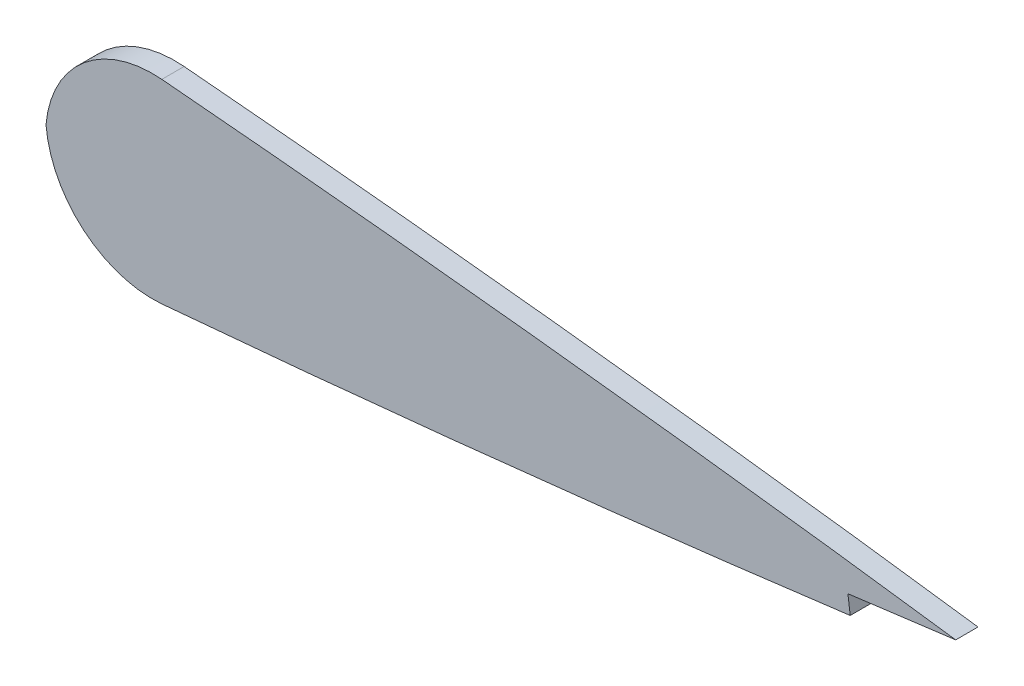
ISO-10303-21;
HEADER;
FILE_DESCRIPTION(('STEP AP214'),'2;1');
FILE_NAME('part.step','',(''),(''),'','','');
FILE_SCHEMA(('AUTOMOTIVE_DESIGN { 1 0 10303 214 1 1 1 1 }'));
ENDSEC;
DATA;
#1=APPLICATION_CONTEXT('core data for automotive mechanical design processes');
#2=APPLICATION_PROTOCOL_DEFINITION('international standard','automotive_design',2000,#1);
#3=PRODUCT_CONTEXT('',#1,'mechanical');
#4=PRODUCT('Part','Part','',(#3));
#5=PRODUCT_RELATED_PRODUCT_CATEGORY('part','',(#4));
#6=PRODUCT_DEFINITION_FORMATION('','',#4);
#7=PRODUCT_DEFINITION_CONTEXT('part definition',#1,'design');
#8=PRODUCT_DEFINITION('design','',#6,#7);
#9=PRODUCT_DEFINITION_SHAPE('','',#8);
#10=(LENGTH_UNIT() NAMED_UNIT(*) SI_UNIT(.MILLI.,.METRE.));
#11=(NAMED_UNIT(*) PLANE_ANGLE_UNIT() SI_UNIT($,.RADIAN.));
#12=(NAMED_UNIT(*) SI_UNIT($,.STERADIAN.) SOLID_ANGLE_UNIT());
#13=UNCERTAINTY_MEASURE_WITH_UNIT(LENGTH_MEASURE(1.E-05),#10,'distance_accuracy_value','');
#14=(GEOMETRIC_REPRESENTATION_CONTEXT(3) GLOBAL_UNCERTAINTY_ASSIGNED_CONTEXT((#13)) GLOBAL_UNIT_ASSIGNED_CONTEXT((#10,
#11,#12)) REPRESENTATION_CONTEXT('',''));
#15=CARTESIAN_POINT('',(0.,0.,0.));
#16=DIRECTION('',(0.,0.,1.));
#17=DIRECTION('',(1.,0.,0.));
#18=AXIS2_PLACEMENT_3D('',#15,#16,#17);
#19=CARTESIAN_POINT('',(318.77,0.4016502,3.175));
#20=CARTESIAN_POINT('',(318.651672050798,0.50081062510207,3.175));
#21=CARTESIAN_POINT('',(317.88713952083,0.407183951533016,3.175));
#22=CARTESIAN_POINT('',(316.525702267064,0.7904298347905,3.175));
#23=CARTESIAN_POINT('',(314.029007456015,1.02731081399014,3.175));
#24=CARTESIAN_POINT('',(310.665580367581,1.53568645613262,3.175));
#25=CARTESIAN_POINT('',(306.332982445315,2.1029997142592,3.175));
#26=CARTESIAN_POINT('',(301.108142880642,2.80218722429085,3.175));
#27=CARTESIAN_POINT('',(295.004655139781,3.59255228155884,3.175));
#28=CARTESIAN_POINT('',(288.066717305627,4.47252129999186,3.175));
#29=CARTESIAN_POINT('',(280.334877507848,5.42667867616247,3.175));
#30=CARTESIAN_POINT('',(271.857503413929,6.44211126091389,3.175));
#31=CARTESIAN_POINT('',(262.68670258513,7.50622472654808,3.175));
#32=CARTESIAN_POINT('',(252.878949160097,8.60453143464443,3.175));
#33=CARTESIAN_POINT('',(242.494745531819,9.72362194936592,3.175));
#34=CARTESIAN_POINT('',(231.598187206488,10.8495970231666,3.175));
#35=CARTESIAN_POINT('',(220.256428580463,11.9679230852741,3.175));
#36=CARTESIAN_POINT('',(208.539426289446,13.0629021970691,3.175));
#37=CARTESIAN_POINT('',(196.519338709918,14.1201595424354,3.175));
#38=CARTESIAN_POINT('',(184.270405083069,15.1220196708537,3.175));
#39=CARTESIAN_POINT('',(171.867889748649,16.0521472129467,3.175));
#40=CARTESIAN_POINT('',(159.388371015463,16.8932736087619,3.175));
#41=CARTESIAN_POINT('',(146.908740176365,17.6278116310836,3.175));
#42=CARTESIAN_POINT('',(134.505824676557,18.23720410278,3.175));
#43=CARTESIAN_POINT('',(122.256224526093,18.705201006698,3.175));
#44=CARTESIAN_POINT('',(110.23510919994,19.0165345268771,3.175));
#45=CARTESIAN_POINT('',(98.5167667377854,19.1559979551147,3.175));
#46=CARTESIAN_POINT('',(87.1732015056204,19.1125234147679,3.175));
#47=CARTESIAN_POINT('',(76.2743495407503,18.8777134468916,3.175));
#48=CARTESIAN_POINT('',(65.8872982521429,18.4456158754961,3.175));
#49=CARTESIAN_POINT('',(56.0759819312477,17.8151004006929,3.175));
#50=CARTESIAN_POINT('',(46.9007012854392,16.9880642018893,3.175));
#51=CARTESIAN_POINT('',(38.4176025007467,15.9709664672286,3.175));
#52=CARTESIAN_POINT('',(30.6783927826995,14.7724611931374,3.175));
#53=CARTESIAN_POINT('',(23.7299698701266,13.4050657428601,3.175));
#54=CARTESIAN_POINT('',(17.6130594258367,11.8842416218078,3.175));
#55=CARTESIAN_POINT('',(12.3624203887116,10.2248187616682,3.175));
#56=CARTESIAN_POINT('',(8.00472945000562,8.44225238170004,3.175));
#57=CARTESIAN_POINT('',(4.55388340735938,6.54860238146803,3.175));
#58=CARTESIAN_POINT('',(2.01519229032135,4.54013127991722,3.175));
#59=CARTESIAN_POINT('',(0.389181284538515,2.36824959719999,3.175));
#60=CARTESIAN_POINT('',(-0.181372315669338,0.,3.175));
#61=CARTESIAN_POINT('',(0.389181284538492,-2.36824959719995,3.175));
#62=CARTESIAN_POINT('',(2.01519229032142,-4.5401312799173,3.175));
#63=CARTESIAN_POINT('',(4.55388340735933,-6.54860238146799,3.175));
#64=CARTESIAN_POINT('',(8.00472945000561,-8.44225238170004,3.175));
#65=CARTESIAN_POINT('',(12.3624203887116,-10.2248187616682,3.175));
#66=CARTESIAN_POINT('',(17.6130594258367,-11.8842416218078,3.175));
#67=CARTESIAN_POINT('',(23.7299698701266,-13.4050657428601,3.175));
#68=CARTESIAN_POINT('',(30.6783927826996,-14.7724611931374,3.175));
#69=CARTESIAN_POINT('',(38.4176025007467,-15.9709664672285,3.175));
#70=CARTESIAN_POINT('',(46.9007012854392,-16.9880642018893,3.175));
#71=CARTESIAN_POINT('',(56.0759819312477,-17.8151004006929,3.175));
#72=CARTESIAN_POINT('',(65.8872982521429,-18.4456158754961,3.175));
#73=CARTESIAN_POINT('',(76.2743495407503,-18.8777134468916,3.175));
#74=CARTESIAN_POINT('',(87.1732015056205,-19.1125234147679,3.175));
#75=CARTESIAN_POINT('',(98.5167667377854,-19.1559979551147,3.175));
#76=CARTESIAN_POINT('',(110.23510919994,-19.0165345268771,3.175));
#77=CARTESIAN_POINT('',(122.256224526093,-18.705201006698,3.175));
#78=CARTESIAN_POINT('',(134.505824676556,-18.23720410278,3.175));
#79=CARTESIAN_POINT('',(146.908740176365,-17.6278116310836,3.175));
#80=CARTESIAN_POINT('',(159.388371015463,-16.8932736087619,3.175));
#81=CARTESIAN_POINT('',(171.867889748649,-16.0521472129467,3.175));
#82=CARTESIAN_POINT('',(184.270405083069,-15.1220196708537,3.175));
#83=CARTESIAN_POINT('',(196.519338709918,-14.1201595424354,3.175));
#84=CARTESIAN_POINT('',(208.539426289446,-13.0629021970691,3.175));
#85=CARTESIAN_POINT('',(220.256428580463,-11.9679230852741,3.175));
#86=CARTESIAN_POINT('',(231.598187206488,-10.8495970231665,3.175));
#87=CARTESIAN_POINT('',(242.494745531819,-9.72362194936593,3.175));
#88=CARTESIAN_POINT('',(252.878949160097,-8.60453143464443,3.175));
#89=CARTESIAN_POINT('',(262.68670258513,-7.50622472654809,3.175));
#90=CARTESIAN_POINT('',(271.857503413929,-6.44211126091389,3.175));
#91=CARTESIAN_POINT('',(280.334877507848,-5.42667867616247,3.175));
#92=CARTESIAN_POINT('',(288.066717305627,-4.47252129999186,3.175));
#93=CARTESIAN_POINT('',(295.004655139781,-3.59255228155884,3.175));
#94=CARTESIAN_POINT('',(301.108142880642,-2.80218722429085,3.175));
#95=CARTESIAN_POINT('',(306.332982445315,-2.10299971425921,3.175));
#96=CARTESIAN_POINT('',(310.66558036758,-1.53568645613261,3.175));
#97=CARTESIAN_POINT('',(314.029007456015,-1.02731081399015,3.175));
#98=CARTESIAN_POINT('',(316.525702267064,-0.790429834790499,3.175));
#99=CARTESIAN_POINT('',(317.88713952083,-0.407183951532999,3.175));
#100=CARTESIAN_POINT('',(318.961628570184,-0.538768719393173,3.175));
#101=CARTESIAN_POINT('',(318.961628570184,0.241062861088163,3.175));
#102=CARTESIAN_POINT('',(318.77,0.4016502,3.175));
#103=B_SPLINE_CURVE_WITH_KNOTS('',3,(#19,#20,#21,#22,#23,#24,#25,#26,#27,#28,#29,#30,#31,#32,
#33,#34,#35,#36,#37,#38,#39,#40,#41,#42,#43,#44,#45,#46,#47,#48,#49,#50,#51,#52,#53,#54,#55,#56,
#57,#58,#59,#60,#61,#62,#63,#64,#65,#66,#67,#68,#69,#70,#71,#72,#73,#74,#75,#76,#77,#78,#79,#80,
#81,#82,#83,#84,#85,#86,#87,#88,#89,#90,#91,#92,#93,#94,#95,#96,#97,#98,#99,#100,#101,#102),
.UNSPECIFIED.,.T.,.F.,(4,1,1,1,1,1,1,1,1,1,1,1,1,1,1,1,1,1,1,1,1,1,1,1,1,1,1,1,1,1,1,1,1,1,1,1,
1,1,1,1,1,1,1,1,1,1,1,1,1,1,1,1,1,1,1,1,1,1,1,1,1,1,1,1,1,1,1,1,1,1,1,1,1,1,1,1,1,1,1,1,1,4),
(0.,0.00076221465102857,0.00304470631082172,0.00683224554312919,0.0121011758037585,
0.0188175356586858,0.026939454793122,0.0364148482585568,0.0471846285955964,0.0591804130998147,
0.0723278736139124,0.0865440610891483,0.101740580336553,0.117823336433574,0.134691452208322,
0.152240154447155,0.170361289964637,0.188941007849542,0.207865435445639,0.227016078022501,
0.246275695980001,0.265524943249896,0.284644966110444,0.303520118268662,0.322034575374331,
0.340078352914118,0.357542593241702,0.374325481920834,0.390329890871888,0.405463889739095,
0.419643801445685,0.43279337139134,0.444843816743186,0.455737920704734,0.465428653233085,
0.473886320085416,0.481101634077569,0.487101684418678,0.491975368345093,0.495930677807379,
0.499382808099288,0.502834938391198,0.506790247853484,0.511663931779899,0.517663982121008,
0.524879296113161,0.533336962965492,0.543027695493843,0.553921799455391,0.565972244807237,
0.579121814752892,0.593301726459482,0.608435725326689,0.624440134277742,0.641223022956875,
0.658687263284459,0.676731040824246,0.695245497929915,0.714120650088133,0.733240672948681,
0.752489920218576,0.771749538176075,0.790900180752937,0.809824608349034,0.82840432623394,
0.846525461751422,0.864074163990254,0.880942279765002,0.897025035862024,0.912221555109428,
0.926437742584664,0.939585203098762,0.95158098760298,0.96235076794002,0.971826161405454,
0.97994808053989,0.986664440394818,0.991933370655447,0.995720909887755,0.998003401547548,
0.998765616198576,1.),.UNSPECIFIED.);
#104=DIRECTION('',(0.,0.,-1.));
#105=VECTOR('',#104,1.);
#106=SURFACE_OF_LINEAR_EXTRUSION('',#103,#105);
#107=DIRECTION('',(0.,0.,1.));
#108=VECTOR('',#107,1.);
#109=CARTESIAN_POINT('',(297.581242724208,-3.25803059173395,0.));
#110=LINE('',#109,#108);
#111=CARTESIAN_POINT('',(297.581242724208,-3.25803059173395,0.));
#112=VERTEX_POINT('',#111);
#113=CARTESIAN_POINT('',(297.581242724208,-3.25803059173395,3.175));
#114=VERTEX_POINT('',#113);
#115=EDGE_CURVE('E93',#112,#114,#110,.T.);
#116=ORIENTED_EDGE('',*,*,#115,.T.);
#117=CARTESIAN_POINT('',(199.575539960691,-13.8459475793617,3.175));
#118=VERTEX_POINT('',#117);
#119=EDGE_CURVE('E115',#118,#114,#103,.T.);
#120=ORIENTED_EDGE('',*,*,#119,.F.);
#121=DIRECTION('',(0.,0.,-1.));
#122=VECTOR('',#121,1.);
#123=CARTESIAN_POINT('',(199.575539960691,-13.8459475793617,3.175));
#124=LINE('',#123,#122);
#125=CARTESIAN_POINT('',(199.575539960691,-13.8459475793617,0.));
#126=VERTEX_POINT('',#125);
#127=EDGE_CURVE('E111',#118,#126,#124,.T.);
#128=ORIENTED_EDGE('',*,*,#127,.T.);
#129=CARTESIAN_POINT('',(318.77,0.4016502,0.));
#130=CARTESIAN_POINT('',(318.651672050798,0.50081062510207,0.));
#131=CARTESIAN_POINT('',(317.88713952083,0.407183951533016,0.));
#132=CARTESIAN_POINT('',(316.525702267064,0.7904298347905,0.));
#133=CARTESIAN_POINT('',(314.029007456015,1.02731081399014,0.));
#134=CARTESIAN_POINT('',(310.665580367581,1.53568645613262,0.));
#135=CARTESIAN_POINT('',(306.332982445315,2.1029997142592,0.));
#136=CARTESIAN_POINT('',(301.108142880642,2.80218722429085,0.));
#137=CARTESIAN_POINT('',(295.004655139781,3.59255228155884,0.));
#138=CARTESIAN_POINT('',(288.066717305627,4.47252129999186,0.));
#139=CARTESIAN_POINT('',(280.334877507848,5.42667867616247,0.));
#140=CARTESIAN_POINT('',(271.857503413929,6.44211126091389,0.));
#141=CARTESIAN_POINT('',(262.68670258513,7.50622472654808,0.));
#142=CARTESIAN_POINT('',(252.878949160097,8.60453143464443,0.));
#143=CARTESIAN_POINT('',(242.494745531819,9.72362194936592,0.));
#144=CARTESIAN_POINT('',(231.598187206488,10.8495970231666,0.));
#145=CARTESIAN_POINT('',(220.256428580463,11.9679230852741,0.));
#146=CARTESIAN_POINT('',(208.539426289446,13.0629021970691,0.));
#147=CARTESIAN_POINT('',(196.519338709918,14.1201595424354,0.));
#148=CARTESIAN_POINT('',(184.270405083069,15.1220196708537,0.));
#149=CARTESIAN_POINT('',(171.867889748649,16.0521472129467,0.));
#150=CARTESIAN_POINT('',(159.388371015463,16.8932736087619,0.));
#151=CARTESIAN_POINT('',(146.908740176365,17.6278116310836,0.));
#152=CARTESIAN_POINT('',(134.505824676557,18.23720410278,0.));
#153=CARTESIAN_POINT('',(122.256224526093,18.705201006698,0.));
#154=CARTESIAN_POINT('',(110.23510919994,19.0165345268771,0.));
#155=CARTESIAN_POINT('',(98.5167667377854,19.1559979551147,0.));
#156=CARTESIAN_POINT('',(87.1732015056204,19.1125234147679,0.));
#157=CARTESIAN_POINT('',(76.2743495407503,18.8777134468916,0.));
#158=CARTESIAN_POINT('',(65.8872982521429,18.4456158754961,0.));
#159=CARTESIAN_POINT('',(56.0759819312477,17.8151004006929,0.));
#160=CARTESIAN_POINT('',(46.9007012854392,16.9880642018893,0.));
#161=CARTESIAN_POINT('',(38.4176025007467,15.9709664672286,0.));
#162=CARTESIAN_POINT('',(30.6783927826995,14.7724611931374,0.));
#163=CARTESIAN_POINT('',(23.7299698701266,13.4050657428601,0.));
#164=CARTESIAN_POINT('',(17.6130594258367,11.8842416218078,0.));
#165=CARTESIAN_POINT('',(12.3624203887116,10.2248187616682,0.));
#166=CARTESIAN_POINT('',(8.00472945000562,8.44225238170004,0.));
#167=CARTESIAN_POINT('',(4.55388340735938,6.54860238146803,0.));
#168=CARTESIAN_POINT('',(2.01519229032135,4.54013127991722,0.));
#169=CARTESIAN_POINT('',(0.389181284538515,2.36824959719999,0.));
#170=CARTESIAN_POINT('',(-0.181372315669338,0.,0.));
#171=CARTESIAN_POINT('',(0.389181284538492,-2.36824959719995,0.));
#172=CARTESIAN_POINT('',(2.01519229032142,-4.5401312799173,0.));
#173=CARTESIAN_POINT('',(4.55388340735933,-6.54860238146799,0.));
#174=CARTESIAN_POINT('',(8.00472945000561,-8.44225238170004,0.));
#175=CARTESIAN_POINT('',(12.3624203887116,-10.2248187616682,0.));
#176=CARTESIAN_POINT('',(17.6130594258367,-11.8842416218078,0.));
#177=CARTESIAN_POINT('',(23.7299698701266,-13.4050657428601,0.));
#178=CARTESIAN_POINT('',(30.6783927826996,-14.7724611931374,0.));
#179=CARTESIAN_POINT('',(38.4176025007467,-15.9709664672285,0.));
#180=CARTESIAN_POINT('',(46.9007012854392,-16.9880642018893,0.));
#181=CARTESIAN_POINT('',(56.0759819312477,-17.8151004006929,0.));
#182=CARTESIAN_POINT('',(65.8872982521429,-18.4456158754961,0.));
#183=CARTESIAN_POINT('',(76.2743495407503,-18.8777134468916,0.));
#184=CARTESIAN_POINT('',(87.1732015056205,-19.1125234147679,0.));
#185=CARTESIAN_POINT('',(98.5167667377854,-19.1559979551147,0.));
#186=CARTESIAN_POINT('',(110.23510919994,-19.0165345268771,0.));
#187=CARTESIAN_POINT('',(122.256224526093,-18.705201006698,0.));
#188=CARTESIAN_POINT('',(134.505824676556,-18.23720410278,0.));
#189=CARTESIAN_POINT('',(146.908740176365,-17.6278116310836,0.));
#190=CARTESIAN_POINT('',(159.388371015463,-16.8932736087619,0.));
#191=CARTESIAN_POINT('',(171.867889748649,-16.0521472129467,0.));
#192=CARTESIAN_POINT('',(184.270405083069,-15.1220196708537,0.));
#193=CARTESIAN_POINT('',(196.519338709918,-14.1201595424354,0.));
#194=CARTESIAN_POINT('',(208.539426289446,-13.0629021970691,0.));
#195=CARTESIAN_POINT('',(220.256428580463,-11.9679230852741,0.));
#196=CARTESIAN_POINT('',(231.598187206488,-10.8495970231665,0.));
#197=CARTESIAN_POINT('',(242.494745531819,-9.72362194936593,0.));
#198=CARTESIAN_POINT('',(252.878949160097,-8.60453143464443,0.));
#199=CARTESIAN_POINT('',(262.68670258513,-7.50622472654809,0.));
#200=CARTESIAN_POINT('',(271.857503413929,-6.44211126091389,0.));
#201=CARTESIAN_POINT('',(280.334877507848,-5.42667867616247,0.));
#202=CARTESIAN_POINT('',(288.066717305627,-4.47252129999186,0.));
#203=CARTESIAN_POINT('',(295.004655139781,-3.59255228155884,0.));
#204=CARTESIAN_POINT('',(301.108142880642,-2.80218722429085,0.));
#205=CARTESIAN_POINT('',(306.332982445315,-2.10299971425921,0.));
#206=CARTESIAN_POINT('',(310.66558036758,-1.53568645613261,0.));
#207=CARTESIAN_POINT('',(314.029007456015,-1.02731081399015,0.));
#208=CARTESIAN_POINT('',(316.525702267064,-0.790429834790499,0.));
#209=CARTESIAN_POINT('',(317.88713952083,-0.407183951532999,0.));
#210=CARTESIAN_POINT('',(318.961628570184,-0.538768719393173,0.));
#211=CARTESIAN_POINT('',(318.961628570184,0.241062861088163,0.));
#212=CARTESIAN_POINT('',(318.77,0.4016502,0.));
#213=B_SPLINE_CURVE_WITH_KNOTS('',3,(#129,#130,#131,#132,#133,#134,#135,#136,#137,#138,#139,
#140,#141,#142,#143,#144,#145,#146,#147,#148,#149,#150,#151,#152,#153,#154,#155,#156,#157,#158,
#159,#160,#161,#162,#163,#164,#165,#166,#167,#168,#169,#170,#171,#172,#173,#174,#175,#176,#177,
#178,#179,#180,#181,#182,#183,#184,#185,#186,#187,#188,#189,#190,#191,#192,#193,#194,#195,#196,
#197,#198,#199,#200,#201,#202,#203,#204,#205,#206,#207,#208,#209,#210,#211,#212),.UNSPECIFIED.,
.T.,.F.,(4,1,1,1,1,1,1,1,1,1,1,1,1,1,1,1,1,1,1,1,1,1,1,1,1,1,1,1,1,1,1,1,1,1,1,1,1,1,1,1,1,1,1,
1,1,1,1,1,1,1,1,1,1,1,1,1,1,1,1,1,1,1,1,1,1,1,1,1,1,1,1,1,1,1,1,1,1,1,1,1,1,4),(0.,
0.00076221465102857,0.00304470631082172,0.00683224554312919,0.0121011758037585,
0.0188175356586858,0.026939454793122,0.0364148482585568,0.0471846285955964,0.0591804130998147,
0.0723278736139124,0.0865440610891483,0.101740580336553,0.117823336433574,0.134691452208322,
0.152240154447155,0.170361289964637,0.188941007849542,0.207865435445639,0.227016078022501,
0.246275695980001,0.265524943249896,0.284644966110444,0.303520118268662,0.322034575374331,
0.340078352914118,0.357542593241702,0.374325481920834,0.390329890871888,0.405463889739095,
0.419643801445685,0.43279337139134,0.444843816743186,0.455737920704734,0.465428653233085,
0.473886320085416,0.481101634077569,0.487101684418678,0.491975368345093,0.495930677807379,
0.499382808099288,0.502834938391198,0.506790247853484,0.511663931779899,0.517663982121008,
0.524879296113161,0.533336962965492,0.543027695493843,0.553921799455391,0.565972244807237,
0.579121814752892,0.593301726459482,0.608435725326689,0.624440134277742,0.641223022956875,
0.658687263284459,0.676731040824246,0.695245497929915,0.714120650088133,0.733240672948681,
0.752489920218576,0.771749538176075,0.790900180752937,0.809824608349034,0.82840432623394,
0.846525461751422,0.864074163990254,0.880942279765002,0.897025035862024,0.912221555109428,
0.926437742584664,0.939585203098762,0.95158098760298,0.96235076794002,0.971826161405454,
0.97994808053989,0.986664440394818,0.991933370655447,0.995720909887755,0.998003401547548,
0.998765616198576,1.),.UNSPECIFIED.);
#214=EDGE_CURVE('E105',#126,#112,#213,.T.);
#215=ORIENTED_EDGE('',*,*,#214,.T.);
#216=EDGE_LOOP('',(#116,#120,#128,#215));
#217=FACE_BOUND('',#216,.T.);
#218=ADVANCED_FACE('F42',(#217),#106,.F.);
#219=CARTESIAN_POINT('',(312.601983818788,1.24586846325318,3.175));
#220=VERTEX_POINT('',#219);
#221=CARTESIAN_POINT('',(199.575539960691,13.8459475793617,3.175));
#222=VERTEX_POINT('',#221);
#223=EDGE_CURVE('E112',#220,#222,#103,.T.);
#224=ORIENTED_EDGE('',*,*,#223,.F.);
#225=DIRECTION('',(0.,0.,-1.));
#226=VECTOR('',#225,1.);
#227=CARTESIAN_POINT('',(312.60198385248,1.24586846761085,3.175));
#228=LINE('',#227,#226);
#229=CARTESIAN_POINT('',(312.601983818788,1.24586846325318,0.));
#230=VERTEX_POINT('',#229);
#231=EDGE_CURVE('E139',#220,#230,#228,.T.);
#232=ORIENTED_EDGE('',*,*,#231,.T.);
#233=CARTESIAN_POINT('',(199.575539960691,13.8459475793617,0.));
#234=VERTEX_POINT('',#233);
#235=EDGE_CURVE('E113',#230,#234,#213,.T.);
#236=ORIENTED_EDGE('',*,*,#235,.T.);
#237=DIRECTION('',(0.,0.,-1.));
#238=VECTOR('',#237,1.);
#239=CARTESIAN_POINT('',(199.575539960691,13.8459475793617,0.));
#240=LINE('',#239,#238);
#241=EDGE_CURVE('E132',#234,#222,#240,.F.);
#242=ORIENTED_EDGE('',*,*,#241,.T.);
#243=EDGE_LOOP('',(#224,#232,#236,#242));
#244=FACE_BOUND('',#243,.T.);
#245=ADVANCED_FACE('F164',(#244),#106,.F.);
#246=CARTESIAN_POINT('',(0.0170900845920282,-0.403411610866982,3.175));
#247=DIRECTION('',(0.,0.,-1.));
#248=DIRECTION('',(-1.,0.,0.));
#249=AXIS2_PLACEMENT_3D('',#246,#247,#248);
#250=PLANE('',#249);
#251=ORIENTED_EDGE('',*,*,#119,.T.);
#252=DIRECTION('',(0.12826892093441,-0.991739423398264,0.));
#253=VECTOR('',#252,1.);
#254=CARTESIAN_POINT('',(297.581242724208,-3.25803059173395,3.175));
#255=LINE('',#254,#253);
#256=CARTESIAN_POINT('',(297.255439665035,-0.739012456302352,3.175));
#257=VERTEX_POINT('',#256);
#258=EDGE_CURVE('E96',#257,#114,#255,.T.);
#259=ORIENTED_EDGE('',*,*,#258,.F.);
#260=DIRECTION('',(-0.991739423398265,-0.128268920934407,0.));
#261=VECTOR('',#260,1.);
#262=CARTESIAN_POINT('',(297.255439665035,-0.739012456302352,3.175));
#263=LINE('',#262,#261);
#264=EDGE_CURVE('E107',#220,#257,#263,.T.);
#265=ORIENTED_EDGE('',*,*,#264,.F.);
#266=ORIENTED_EDGE('',*,*,#223,.T.);
#267=CARTESIAN_POINT('',(198.263721427638,-1.33748853162255,3.175));
#268=DIRECTION('',(0.,0.,-1.));
#269=DIRECTION('',(-1.,0.,0.));
#270=AXIS2_PLACEMENT_3D('',#267,#268,#269);
#271=CIRCLE('',#270,15.24);
#272=CARTESIAN_POINT('',(183.082525018008,1.51571463713474E-13,3.175));
#273=VERTEX_POINT('',#272);
#274=EDGE_CURVE('E125',#222,#273,#271,.F.);
#275=ORIENTED_EDGE('',*,*,#274,.T.);
#276=CARTESIAN_POINT('',(198.263721427638,1.33748853162254,3.175));
#277=DIRECTION('',(0.,0.,-1.));
#278=DIRECTION('',(-1.,0.,0.));
#279=AXIS2_PLACEMENT_3D('',#276,#277,#278);
#280=CIRCLE('',#279,15.24);
#281=EDGE_CURVE('E130',#273,#118,#280,.F.);
#282=ORIENTED_EDGE('',*,*,#281,.T.);
#283=EDGE_LOOP('',(#251,#259,#265,#266,#275,#282));
#284=FACE_BOUND('',#283,.T.);
#285=ADVANCED_FACE('F153',(#284),#250,.F.);
#286=CARTESIAN_POINT('',(0.0170900845920282,-0.403411610866982,0.));
#287=DIRECTION('',(0.,0.,-1.));
#288=DIRECTION('',(-1.,0.,0.));
#289=AXIS2_PLACEMENT_3D('',#286,#287,#288);
#290=PLANE('',#289);
#291=DIRECTION('',(0.12826892093441,-0.991739423398264,0.));
#292=VECTOR('',#291,1.);
#293=CARTESIAN_POINT('',(297.581242724208,-3.25803059173395,0.));
#294=LINE('',#293,#292);
#295=CARTESIAN_POINT('',(297.255439665035,-0.739012456302347,0.));
#296=VERTEX_POINT('',#295);
#297=EDGE_CURVE('E57',#296,#112,#294,.T.);
#298=ORIENTED_EDGE('',*,*,#297,.T.);
#299=ORIENTED_EDGE('',*,*,#214,.F.);
#300=CARTESIAN_POINT('',(198.263721427638,1.33748853162254,0.));
#301=DIRECTION('',(0.,0.,-1.));
#302=DIRECTION('',(-1.,0.,0.));
#303=AXIS2_PLACEMENT_3D('',#300,#301,#302);
#304=CIRCLE('',#303,15.24);
#305=CARTESIAN_POINT('',(183.082525018008,1.51571463713474E-13,0.));
#306=VERTEX_POINT('',#305);
#307=EDGE_CURVE('E50',#126,#306,#304,.T.);
#308=ORIENTED_EDGE('',*,*,#307,.T.);
#309=CARTESIAN_POINT('',(198.263721427638,-1.33748853162255,0.));
#310=DIRECTION('',(0.,0.,-1.));
#311=DIRECTION('',(-1.,0.,0.));
#312=AXIS2_PLACEMENT_3D('',#309,#310,#311);
#313=CIRCLE('',#312,15.24);
#314=EDGE_CURVE('E136',#306,#234,#313,.T.);
#315=ORIENTED_EDGE('',*,*,#314,.T.);
#316=ORIENTED_EDGE('',*,*,#235,.F.);
#317=DIRECTION('',(0.991739423398265,0.128268920934407,0.));
#318=VECTOR('',#317,1.);
#319=CARTESIAN_POINT('',(4.95021926926631,-38.5449868070896,0.));
#320=LINE('',#319,#318);
#321=EDGE_CURVE('E11',#296,#230,#320,.T.);
#322=ORIENTED_EDGE('',*,*,#321,.F.);
#323=EDGE_LOOP('',(#298,#299,#308,#315,#316,#322));
#324=FACE_BOUND('',#323,.T.);
#325=ADVANCED_FACE('F104',(#324),#290,.T.);
#326=CARTESIAN_POINT('',(198.263721427638,-1.33748853162255,1.5875));
#327=DIRECTION('',(0.,0.,-1.));
#328=DIRECTION('',(-1.,0.,0.));
#329=AXIS2_PLACEMENT_3D('',#326,#327,#328);
#330=CYLINDRICAL_SURFACE('',#329,15.24);
#331=ORIENTED_EDGE('',*,*,#241,.F.);
#332=ORIENTED_EDGE('',*,*,#314,.F.);
#333=DIRECTION('',(0.,0.,-1.));
#334=VECTOR('',#333,1.);
#335=CARTESIAN_POINT('',(183.082525018008,1.50704101975485E-13,1.5875));
#336=LINE('',#335,#334);
#337=EDGE_CURVE('E117',#273,#306,#336,.T.);
#338=ORIENTED_EDGE('',*,*,#337,.F.);
#339=ORIENTED_EDGE('',*,*,#274,.F.);
#340=EDGE_LOOP('',(#331,#332,#338,#339));
#341=FACE_BOUND('',#340,.T.);
#342=ADVANCED_FACE('F44',(#341),#330,.T.);
#343=CARTESIAN_POINT('',(198.263721427638,1.33748853162254,1.5875));
#344=DIRECTION('',(0.,0.,-1.));
#345=DIRECTION('',(-1.,0.,0.));
#346=AXIS2_PLACEMENT_3D('',#343,#344,#345);
#347=CYLINDRICAL_SURFACE('',#346,15.24);
#348=ORIENTED_EDGE('',*,*,#307,.F.);
#349=ORIENTED_EDGE('',*,*,#127,.F.);
#350=ORIENTED_EDGE('',*,*,#281,.F.);
#351=ORIENTED_EDGE('',*,*,#337,.T.);
#352=EDGE_LOOP('',(#348,#349,#350,#351));
#353=FACE_BOUND('',#352,.T.);
#354=ADVANCED_FACE('F154',(#353),#347,.T.);
#355=CARTESIAN_POINT('',(297.255439665035,-0.739012456302352,0.));
#356=DIRECTION('',(-0.128268920934407,0.991739423398265,0.));
#357=DIRECTION('',(-0.991739423398265,-0.128268920934407,0.));
#358=AXIS2_PLACEMENT_3D('',#355,#356,#357);
#359=PLANE('',#358);
#360=ORIENTED_EDGE('',*,*,#264,.T.);
#361=DIRECTION('',(0.,0.,1.));
#362=VECTOR('',#361,1.);
#363=CARTESIAN_POINT('',(297.255439665035,-0.739012456302352,0.));
#364=LINE('',#363,#362);
#365=EDGE_CURVE('E101',#296,#257,#364,.T.);
#366=ORIENTED_EDGE('',*,*,#365,.F.);
#367=ORIENTED_EDGE('',*,*,#321,.T.);
#368=ORIENTED_EDGE('',*,*,#231,.F.);
#369=EDGE_LOOP('',(#360,#366,#367,#368));
#370=FACE_BOUND('',#369,.T.);
#371=ADVANCED_FACE('F151',(#370),#359,.F.);
#372=CARTESIAN_POINT('',(297.581242724208,-3.25803059173395,0.));
#373=DIRECTION('',(-0.991739423398265,-0.12826892093441,0.));
#374=DIRECTION('',(0.12826892093441,-0.991739423398264,0.));
#375=AXIS2_PLACEMENT_3D('',#372,#373,#374);
#376=PLANE('',#375);
#377=ORIENTED_EDGE('',*,*,#258,.T.);
#378=ORIENTED_EDGE('',*,*,#115,.F.);
#379=ORIENTED_EDGE('',*,*,#297,.F.);
#380=ORIENTED_EDGE('',*,*,#365,.T.);
#381=EDGE_LOOP('',(#377,#378,#379,#380));
#382=FACE_BOUND('',#381,.T.);
#383=ADVANCED_FACE('F94',(#382),#376,.F.);
#384=CLOSED_SHELL('',(#218,#245,#285,#325,#342,#354,#371,#383));
#385=MANIFOLD_SOLID_BREP('B2',#384);
#386=ADVANCED_BREP_SHAPE_REPRESENTATION('',(#18,#385),#14);
#387=SHAPE_DEFINITION_REPRESENTATION(#9,#386);
ENDSEC;
END-ISO-10303-21;
